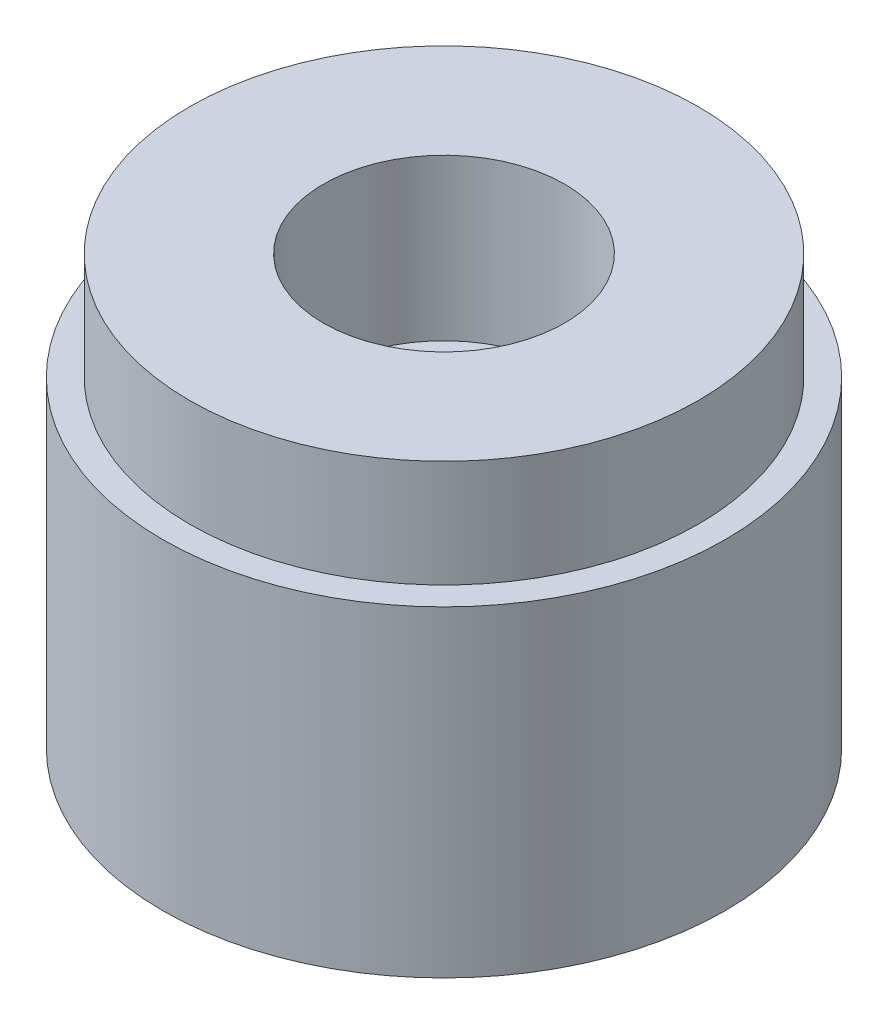
ISO-10303-21;
HEADER;
FILE_DESCRIPTION(('STEP AP214'),'2;1');
FILE_NAME('part.step','',(''),(''),'','','');
FILE_SCHEMA(('AUTOMOTIVE_DESIGN { 1 0 10303 214 1 1 1 1 }'));
ENDSEC;
DATA;
#1=APPLICATION_CONTEXT('core data for automotive mechanical design processes');
#2=APPLICATION_PROTOCOL_DEFINITION('international standard','automotive_design',2000,#1);
#3=PRODUCT_CONTEXT('',#1,'mechanical');
#4=PRODUCT('Part','Part','',(#3));
#5=PRODUCT_RELATED_PRODUCT_CATEGORY('part','',(#4));
#6=PRODUCT_DEFINITION_FORMATION('','',#4);
#7=PRODUCT_DEFINITION_CONTEXT('part definition',#1,'design');
#8=PRODUCT_DEFINITION('design','',#6,#7);
#9=PRODUCT_DEFINITION_SHAPE('','',#8);
#10=(LENGTH_UNIT() NAMED_UNIT(*) SI_UNIT(.MILLI.,.METRE.));
#11=(NAMED_UNIT(*) PLANE_ANGLE_UNIT() SI_UNIT($,.RADIAN.));
#12=(NAMED_UNIT(*) SI_UNIT($,.STERADIAN.) SOLID_ANGLE_UNIT());
#13=UNCERTAINTY_MEASURE_WITH_UNIT(LENGTH_MEASURE(1.E-05),#10,'distance_accuracy_value','');
#14=(GEOMETRIC_REPRESENTATION_CONTEXT(3) GLOBAL_UNCERTAINTY_ASSIGNED_CONTEXT((#13)) GLOBAL_UNIT_ASSIGNED_CONTEXT((#10,
#11,#12)) REPRESENTATION_CONTEXT('',''));
#15=CARTESIAN_POINT('',(0.,0.,0.));
#16=DIRECTION('',(0.,0.,1.));
#17=DIRECTION('',(1.,0.,0.));
#18=AXIS2_PLACEMENT_3D('',#15,#16,#17);
#19=CARTESIAN_POINT('',(0.,0.,0.));
#20=DIRECTION('',(0.,-1.,0.));
#21=DIRECTION('',(0.,0.,-1.));
#22=AXIS2_PLACEMENT_3D('',#19,#20,#21);
#23=CYLINDRICAL_SURFACE('',#22,1.35);
#24=CARTESIAN_POINT('',(0.,0.,0.));
#25=DIRECTION('',(0.,-1.,0.));
#26=DIRECTION('',(0.,0.,-1.));
#27=AXIS2_PLACEMENT_3D('',#24,#25,#26);
#28=CIRCLE('',#27,1.35);
#29=CARTESIAN_POINT('',(0.,0.,-1.35));
#30=VERTEX_POINT('',#29);
#31=EDGE_CURVE('E10',#30,#30,#28,.T.);
#32=ORIENTED_EDGE('',*,*,#31,.T.);
#33=EDGE_LOOP('',(#32));
#34=FACE_BOUND('',#33,.T.);
#35=CARTESIAN_POINT('',(0.,5.,0.));
#36=DIRECTION('',(0.,1.,0.));
#37=DIRECTION('',(0.,0.,1.));
#38=AXIS2_PLACEMENT_3D('',#35,#36,#37);
#39=CIRCLE('',#38,1.35);
#40=CARTESIAN_POINT('',(0.,5.,1.35));
#41=VERTEX_POINT('',#40);
#42=EDGE_CURVE('E35',#41,#41,#39,.T.);
#43=ORIENTED_EDGE('',*,*,#42,.T.);
#44=EDGE_LOOP('',(#43));
#45=FACE_BOUND('',#44,.T.);
#46=ADVANCED_FACE('F31',(#34,#45),#23,.F.);
#47=CARTESIAN_POINT('',(5.25,0.,0.));
#48=DIRECTION('',(0.,-1.,0.));
#49=DIRECTION('',(0.,0.,-1.));
#50=AXIS2_PLACEMENT_3D('',#47,#48,#49);
#51=PLANE('',#50);
#52=CARTESIAN_POINT('',(0.,0.,0.));
#53=DIRECTION('',(0.,-1.,0.));
#54=DIRECTION('',(0.,0.,-1.));
#55=AXIS2_PLACEMENT_3D('',#52,#53,#54);
#56=CIRCLE('',#55,5.25);
#57=CARTESIAN_POINT('',(0.,0.,-5.25));
#58=VERTEX_POINT('',#57);
#59=EDGE_CURVE('E51',#58,#58,#56,.T.);
#60=ORIENTED_EDGE('',*,*,#59,.T.);
#61=EDGE_LOOP('',(#60));
#62=FACE_BOUND('',#61,.T.);
#63=ORIENTED_EDGE('',*,*,#31,.F.);
#64=EDGE_LOOP('',(#63));
#65=FACE_BOUND('',#64,.T.);
#66=ADVANCED_FACE('F33',(#62,#65),#51,.T.);
#67=CARTESIAN_POINT('',(1.35,8.,0.));
#68=DIRECTION('',(0.,1.,0.));
#69=DIRECTION('',(0.,0.,1.));
#70=AXIS2_PLACEMENT_3D('',#67,#68,#69);
#71=PLANE('',#70);
#72=CARTESIAN_POINT('',(0.,8.,0.));
#73=DIRECTION('',(0.,1.,0.));
#74=DIRECTION('',(0.,0.,1.));
#75=AXIS2_PLACEMENT_3D('',#72,#73,#74);
#76=CIRCLE('',#75,2.25);
#77=CARTESIAN_POINT('',(0.,8.,2.25));
#78=VERTEX_POINT('',#77);
#79=EDGE_CURVE('E54',#78,#78,#76,.T.);
#80=ORIENTED_EDGE('',*,*,#79,.F.);
#81=EDGE_LOOP('',(#80));
#82=FACE_BOUND('',#81,.T.);
#83=CARTESIAN_POINT('',(0.,8.,0.));
#84=DIRECTION('',(0.,-1.,0.));
#85=DIRECTION('',(0.,0.,-1.));
#86=AXIS2_PLACEMENT_3D('',#83,#84,#85);
#87=CIRCLE('',#86,4.75);
#88=CARTESIAN_POINT('',(0.,8.,-4.75));
#89=VERTEX_POINT('',#88);
#90=EDGE_CURVE('E39',#89,#89,#87,.T.);
#91=ORIENTED_EDGE('',*,*,#90,.F.);
#92=EDGE_LOOP('',(#91));
#93=FACE_BOUND('',#92,.T.);
#94=ADVANCED_FACE('F79',(#82,#93),#71,.T.);
#95=CARTESIAN_POINT('',(0.,0.,0.));
#96=DIRECTION('',(0.,-1.,0.));
#97=DIRECTION('',(0.,0.,-1.));
#98=AXIS2_PLACEMENT_3D('',#95,#96,#97);
#99=CYLINDRICAL_SURFACE('',#98,4.75);
#100=ORIENTED_EDGE('',*,*,#90,.T.);
#101=EDGE_LOOP('',(#100));
#102=FACE_BOUND('',#101,.T.);
#103=CARTESIAN_POINT('',(0.,6.,0.));
#104=DIRECTION('',(0.,-1.,0.));
#105=DIRECTION('',(0.,0.,-1.));
#106=AXIS2_PLACEMENT_3D('',#103,#104,#105);
#107=CIRCLE('',#106,4.75);
#108=CARTESIAN_POINT('',(0.,6.,-4.75));
#109=VERTEX_POINT('',#108);
#110=EDGE_CURVE('E43',#109,#109,#107,.T.);
#111=ORIENTED_EDGE('',*,*,#110,.F.);
#112=EDGE_LOOP('',(#111));
#113=FACE_BOUND('',#112,.T.);
#114=ADVANCED_FACE('F84',(#102,#113),#99,.T.);
#115=CARTESIAN_POINT('',(4.75,6.,0.));
#116=DIRECTION('',(0.,1.,0.));
#117=DIRECTION('',(0.,0.,1.));
#118=AXIS2_PLACEMENT_3D('',#115,#116,#117);
#119=PLANE('',#118);
#120=ORIENTED_EDGE('',*,*,#110,.T.);
#121=EDGE_LOOP('',(#120));
#122=FACE_BOUND('',#121,.T.);
#123=CARTESIAN_POINT('',(0.,6.,0.));
#124=DIRECTION('',(0.,-1.,0.));
#125=DIRECTION('',(0.,0.,-1.));
#126=AXIS2_PLACEMENT_3D('',#123,#124,#125);
#127=CIRCLE('',#126,5.25);
#128=CARTESIAN_POINT('',(0.,6.,-5.25));
#129=VERTEX_POINT('',#128);
#130=EDGE_CURVE('E48',#129,#129,#127,.T.);
#131=ORIENTED_EDGE('',*,*,#130,.F.);
#132=EDGE_LOOP('',(#131));
#133=FACE_BOUND('',#132,.T.);
#134=ADVANCED_FACE('F88',(#122,#133),#119,.T.);
#135=CARTESIAN_POINT('',(0.,0.,0.));
#136=DIRECTION('',(0.,-1.,0.));
#137=DIRECTION('',(0.,0.,-1.));
#138=AXIS2_PLACEMENT_3D('',#135,#136,#137);
#139=CYLINDRICAL_SURFACE('',#138,5.25);
#140=ORIENTED_EDGE('',*,*,#130,.T.);
#141=EDGE_LOOP('',(#140));
#142=FACE_BOUND('',#141,.T.);
#143=ORIENTED_EDGE('',*,*,#59,.F.);
#144=EDGE_LOOP('',(#143));
#145=FACE_BOUND('',#144,.T.);
#146=ADVANCED_FACE('F72',(#142,#145),#139,.T.);
#147=CARTESIAN_POINT('',(0.,5.,0.));
#148=DIRECTION('',(0.,1.,0.));
#149=DIRECTION('',(0.,0.,1.));
#150=AXIS2_PLACEMENT_3D('',#147,#148,#149);
#151=CYLINDRICAL_SURFACE('',#150,2.25);
#152=CARTESIAN_POINT('',(0.,5.,0.));
#153=DIRECTION('',(0.,1.,0.));
#154=DIRECTION('',(0.,0.,1.));
#155=AXIS2_PLACEMENT_3D('',#152,#153,#154);
#156=CIRCLE('',#155,2.25);
#157=CARTESIAN_POINT('',(0.,5.,2.25));
#158=VERTEX_POINT('',#157);
#159=EDGE_CURVE('E57',#158,#158,#156,.T.);
#160=ORIENTED_EDGE('',*,*,#159,.F.);
#161=EDGE_LOOP('',(#160));
#162=FACE_BOUND('',#161,.T.);
#163=ORIENTED_EDGE('',*,*,#79,.T.);
#164=EDGE_LOOP('',(#163));
#165=FACE_BOUND('',#164,.T.);
#166=ADVANCED_FACE('F67',(#162,#165),#151,.F.);
#167=CARTESIAN_POINT('',(0.,5.,0.));
#168=DIRECTION('',(0.,1.,0.));
#169=DIRECTION('',(0.,0.,1.));
#170=AXIS2_PLACEMENT_3D('',#167,#168,#169);
#171=PLANE('',#170);
#172=ORIENTED_EDGE('',*,*,#42,.F.);
#173=EDGE_LOOP('',(#172));
#174=FACE_BOUND('',#173,.T.);
#175=ORIENTED_EDGE('',*,*,#159,.T.);
#176=EDGE_LOOP('',(#175));
#177=FACE_BOUND('',#176,.T.);
#178=ADVANCED_FACE('F65',(#174,#177),#171,.T.);
#179=CLOSED_SHELL('',(#46,#66,#94,#114,#134,#146,#166,#178));
#180=MANIFOLD_SOLID_BREP('B2',#179);
#181=ADVANCED_BREP_SHAPE_REPRESENTATION('',(#18,#180),#14);
#182=SHAPE_DEFINITION_REPRESENTATION(#9,#181);
ENDSEC;
END-ISO-10303-21;
